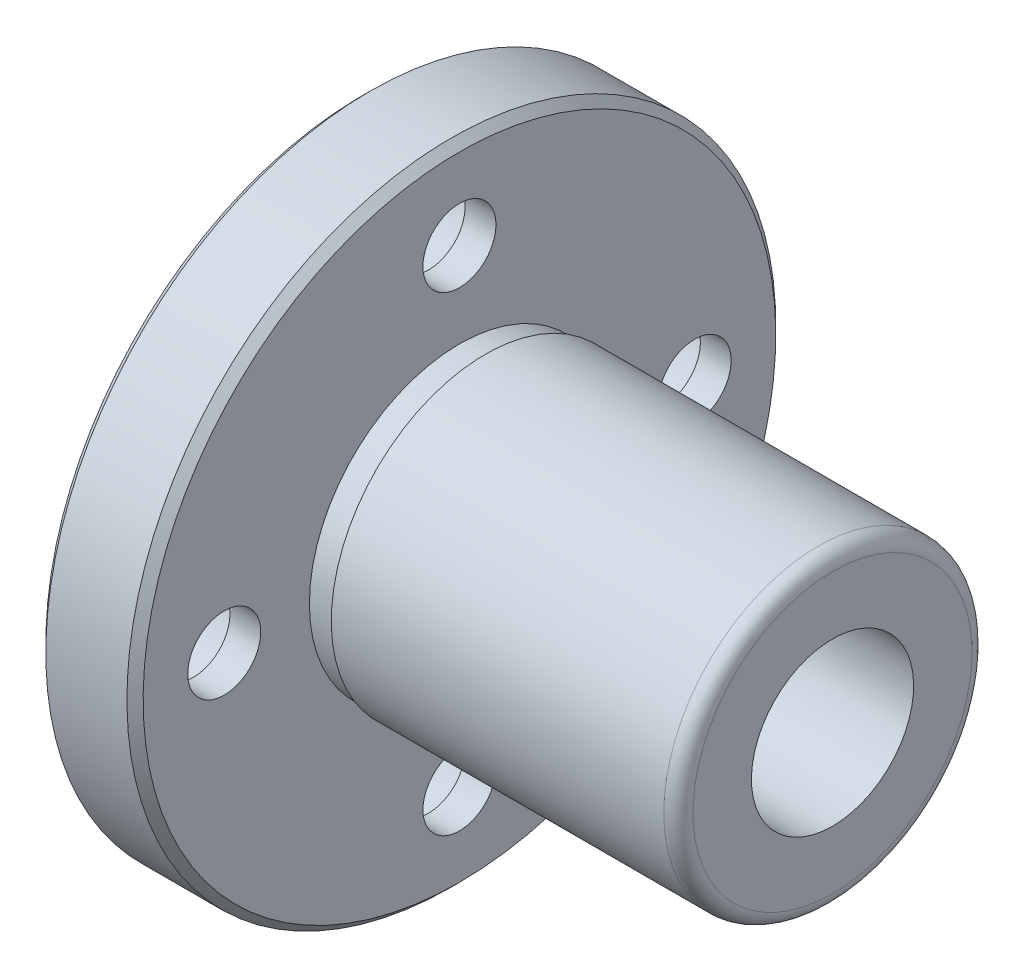
ISO-10303-21;
HEADER;
FILE_DESCRIPTION(('STEP AP214'),'2;1');
FILE_NAME('part.step','',(''),(''),'','','');
FILE_SCHEMA(('AUTOMOTIVE_DESIGN { 1 0 10303 214 1 1 1 1 }'));
ENDSEC;
DATA;
#1=APPLICATION_CONTEXT('core data for automotive mechanical design processes');
#2=APPLICATION_PROTOCOL_DEFINITION('international standard','automotive_design',2000,#1);
#3=PRODUCT_CONTEXT('',#1,'mechanical');
#4=PRODUCT('Part','Part','',(#3));
#5=PRODUCT_RELATED_PRODUCT_CATEGORY('part','',(#4));
#6=PRODUCT_DEFINITION_FORMATION('','',#4);
#7=PRODUCT_DEFINITION_CONTEXT('part definition',#1,'design');
#8=PRODUCT_DEFINITION('design','',#6,#7);
#9=PRODUCT_DEFINITION_SHAPE('','',#8);
#10=(LENGTH_UNIT() NAMED_UNIT(*) SI_UNIT(.MILLI.,.METRE.));
#11=(NAMED_UNIT(*) PLANE_ANGLE_UNIT() SI_UNIT($,.RADIAN.));
#12=(NAMED_UNIT(*) SI_UNIT($,.STERADIAN.) SOLID_ANGLE_UNIT());
#13=UNCERTAINTY_MEASURE_WITH_UNIT(LENGTH_MEASURE(1.E-05),#10,'distance_accuracy_value','');
#14=(GEOMETRIC_REPRESENTATION_CONTEXT(3) GLOBAL_UNCERTAINTY_ASSIGNED_CONTEXT((#13)) GLOBAL_UNIT_ASSIGNED_CONTEXT((#10,
#11,#12)) REPRESENTATION_CONTEXT('',''));
#15=CARTESIAN_POINT('',(0.,0.,0.));
#16=DIRECTION('',(0.,0.,1.));
#17=DIRECTION('',(1.,0.,0.));
#18=AXIS2_PLACEMENT_3D('',#15,#16,#17);
#19=CARTESIAN_POINT('',(-6.,0.,0.));
#20=DIRECTION('',(-1.,0.,0.));
#21=DIRECTION('',(0.,-1.,0.));
#22=AXIS2_PLACEMENT_3D('',#19,#20,#21);
#23=CYLINDRICAL_SURFACE('',#22,9.25);
#24=CARTESIAN_POINT('',(0.,0.,0.));
#25=DIRECTION('',(-1.,0.,0.));
#26=DIRECTION('',(0.,-1.,0.));
#27=AXIS2_PLACEMENT_3D('',#24,#25,#26);
#28=CIRCLE('',#27,9.25);
#29=CARTESIAN_POINT('',(0.,-9.25,0.));
#30=VERTEX_POINT('',#29);
#31=EDGE_CURVE('E208',#30,#30,#28,.F.);
#32=ORIENTED_EDGE('',*,*,#31,.T.);
#33=EDGE_LOOP('',(#32));
#34=FACE_BOUND('',#33,.T.);
#35=CARTESIAN_POINT('',(1.6,0.,0.));
#36=DIRECTION('',(-1.,0.,0.));
#37=DIRECTION('',(0.,-1.,0.));
#38=AXIS2_PLACEMENT_3D('',#35,#36,#37);
#39=CIRCLE('',#38,9.25);
#40=CARTESIAN_POINT('',(1.6,-9.25,0.));
#41=VERTEX_POINT('',#40);
#42=EDGE_CURVE('E211',#41,#41,#39,.T.);
#43=ORIENTED_EDGE('',*,*,#42,.T.);
#44=EDGE_LOOP('',(#43));
#45=FACE_BOUND('',#44,.T.);
#46=ADVANCED_FACE('F17',(#34,#45),#23,.T.);
#47=CARTESIAN_POINT('',(1.6,9.25,0.));
#48=DIRECTION('',(1.,0.,0.));
#49=DIRECTION('',(0.,1.,0.));
#50=AXIS2_PLACEMENT_3D('',#47,#48,#49);
#51=PLANE('',#50);
#52=CARTESIAN_POINT('',(1.6,0.,0.));
#53=DIRECTION('',(-1.,0.,0.));
#54=DIRECTION('',(0.,-1.,0.));
#55=AXIS2_PLACEMENT_3D('',#52,#53,#54);
#56=CIRCLE('',#55,9.5);
#57=CARTESIAN_POINT('',(1.6,-9.5,0.));
#58=VERTEX_POINT('',#57);
#59=EDGE_CURVE('E205',#58,#58,#56,.F.);
#60=ORIENTED_EDGE('',*,*,#59,.F.);
#61=EDGE_LOOP('',(#60));
#62=FACE_BOUND('',#61,.T.);
#63=ORIENTED_EDGE('',*,*,#42,.F.);
#64=EDGE_LOOP('',(#63));
#65=FACE_BOUND('',#64,.T.);
#66=ADVANCED_FACE('F93',(#62,#65),#51,.F.);
#67=CARTESIAN_POINT('',(0.,20.,0.));
#68=DIRECTION('',(-1.,0.,0.));
#69=DIRECTION('',(0.,-1.,0.));
#70=AXIS2_PLACEMENT_3D('',#67,#68,#69);
#71=PLANE('',#70);
#72=ORIENTED_EDGE('',*,*,#31,.F.);
#73=EDGE_LOOP('',(#72));
#74=FACE_BOUND('',#73,.T.);
#75=CARTESIAN_POINT('',(0.,0.,0.));
#76=DIRECTION('',(-1.,0.,0.));
#77=DIRECTION('',(0.,-1.,0.));
#78=AXIS2_PLACEMENT_3D('',#75,#76,#77);
#79=CIRCLE('',#78,19.5);
#80=CARTESIAN_POINT('',(0.,-19.5,0.));
#81=VERTEX_POINT('',#80);
#82=EDGE_CURVE('E190',#81,#81,#79,.T.);
#83=ORIENTED_EDGE('',*,*,#82,.F.);
#84=EDGE_LOOP('',(#83));
#85=FACE_BOUND('',#84,.T.);
#86=CARTESIAN_POINT('',(0.,0.,14.5));
#87=DIRECTION('',(-1.,0.,0.));
#88=DIRECTION('',(0.,0.,1.));
#89=AXIS2_PLACEMENT_3D('',#86,#87,#88);
#90=CIRCLE('',#89,2.25);
#91=CARTESIAN_POINT('',(0.,0.,16.75));
#92=VERTEX_POINT('',#91);
#93=EDGE_CURVE('E193',#92,#92,#90,.T.);
#94=ORIENTED_EDGE('',*,*,#93,.T.);
#95=EDGE_LOOP('',(#94));
#96=FACE_BOUND('',#95,.T.);
#97=CARTESIAN_POINT('',(0.,-14.5,0.));
#98=DIRECTION('',(-1.,0.,0.));
#99=DIRECTION('',(0.,0.,1.));
#100=AXIS2_PLACEMENT_3D('',#97,#98,#99);
#101=CIRCLE('',#100,2.25);
#102=CARTESIAN_POINT('',(0.,-14.5,2.25));
#103=VERTEX_POINT('',#102);
#104=EDGE_CURVE('E196',#103,#103,#101,.T.);
#105=ORIENTED_EDGE('',*,*,#104,.T.);
#106=EDGE_LOOP('',(#105));
#107=FACE_BOUND('',#106,.T.);
#108=CARTESIAN_POINT('',(0.,0.,-14.5));
#109=DIRECTION('',(-1.,0.,0.));
#110=DIRECTION('',(0.,0.,1.));
#111=AXIS2_PLACEMENT_3D('',#108,#109,#110);
#112=CIRCLE('',#111,2.25);
#113=CARTESIAN_POINT('',(0.,0.,-12.25));
#114=VERTEX_POINT('',#113);
#115=EDGE_CURVE('E199',#114,#114,#112,.T.);
#116=ORIENTED_EDGE('',*,*,#115,.T.);
#117=EDGE_LOOP('',(#116));
#118=FACE_BOUND('',#117,.T.);
#119=CARTESIAN_POINT('',(0.,14.5,0.));
#120=DIRECTION('',(-1.,0.,0.));
#121=DIRECTION('',(0.,0.,1.));
#122=AXIS2_PLACEMENT_3D('',#119,#120,#121);
#123=CIRCLE('',#122,2.25);
#124=CARTESIAN_POINT('',(0.,14.5,2.25));
#125=VERTEX_POINT('',#124);
#126=EDGE_CURVE('E202',#125,#125,#123,.T.);
#127=ORIENTED_EDGE('',*,*,#126,.T.);
#128=EDGE_LOOP('',(#127));
#129=FACE_BOUND('',#128,.T.);
#130=ADVANCED_FACE('F90',(#74,#85,#96,#107,#118,#129),#71,.F.);
#131=CARTESIAN_POINT('',(-6.,0.,0.));
#132=DIRECTION('',(-1.,0.,0.));
#133=DIRECTION('',(0.,-1.,0.));
#134=AXIS2_PLACEMENT_3D('',#131,#132,#133);
#135=CYLINDRICAL_SURFACE('',#134,9.5);
#136=CARTESIAN_POINT('',(22.1,0.,0.));
#137=DIRECTION('',(-1.,0.,0.));
#138=DIRECTION('',(0.,-1.,0.));
#139=AXIS2_PLACEMENT_3D('',#136,#137,#138);
#140=CIRCLE('',#139,9.5);
#141=CARTESIAN_POINT('',(22.1,-9.5,0.));
#142=VERTEX_POINT('',#141);
#143=EDGE_CURVE('E189',#142,#142,#140,.F.);
#144=ORIENTED_EDGE('',*,*,#143,.F.);
#145=EDGE_LOOP('',(#144));
#146=FACE_BOUND('',#145,.T.);
#147=ORIENTED_EDGE('',*,*,#59,.T.);
#148=EDGE_LOOP('',(#147));
#149=FACE_BOUND('',#148,.T.);
#150=ADVANCED_FACE('F86',(#146,#149),#135,.T.);
#151=CARTESIAN_POINT('',(-6.,14.5,0.));
#152=DIRECTION('',(-1.,0.,0.));
#153=DIRECTION('',(0.,0.,1.));
#154=AXIS2_PLACEMENT_3D('',#151,#152,#153);
#155=CYLINDRICAL_SURFACE('',#154,2.25);
#156=ORIENTED_EDGE('',*,*,#126,.F.);
#157=EDGE_LOOP('',(#156));
#158=FACE_BOUND('',#157,.T.);
#159=CARTESIAN_POINT('',(-1.9,14.5,0.));
#160=DIRECTION('',(-1.,0.,0.));
#161=DIRECTION('',(0.,0.,1.));
#162=AXIS2_PLACEMENT_3D('',#159,#160,#161);
#163=CIRCLE('',#162,2.25);
#164=CARTESIAN_POINT('',(-1.9,14.5,2.25));
#165=VERTEX_POINT('',#164);
#166=EDGE_CURVE('E186',#165,#165,#163,.T.);
#167=ORIENTED_EDGE('',*,*,#166,.T.);
#168=EDGE_LOOP('',(#167));
#169=FACE_BOUND('',#168,.T.);
#170=ADVANCED_FACE('F82',(#158,#169),#155,.F.);
#171=CARTESIAN_POINT('',(-6.,0.,-14.5));
#172=DIRECTION('',(-1.,0.,0.));
#173=DIRECTION('',(0.,0.,1.));
#174=AXIS2_PLACEMENT_3D('',#171,#172,#173);
#175=CYLINDRICAL_SURFACE('',#174,2.25);
#176=ORIENTED_EDGE('',*,*,#115,.F.);
#177=EDGE_LOOP('',(#176));
#178=FACE_BOUND('',#177,.T.);
#179=CARTESIAN_POINT('',(-1.9,0.,-14.5));
#180=DIRECTION('',(-1.,0.,0.));
#181=DIRECTION('',(0.,0.,1.));
#182=AXIS2_PLACEMENT_3D('',#179,#180,#181);
#183=CIRCLE('',#182,2.25);
#184=CARTESIAN_POINT('',(-1.9,0.,-12.25));
#185=VERTEX_POINT('',#184);
#186=EDGE_CURVE('E183',#185,#185,#183,.T.);
#187=ORIENTED_EDGE('',*,*,#186,.T.);
#188=EDGE_LOOP('',(#187));
#189=FACE_BOUND('',#188,.T.);
#190=ADVANCED_FACE('F78',(#178,#189),#175,.F.);
#191=CARTESIAN_POINT('',(-6.,-14.5,0.));
#192=DIRECTION('',(-1.,0.,0.));
#193=DIRECTION('',(0.,0.,1.));
#194=AXIS2_PLACEMENT_3D('',#191,#192,#193);
#195=CYLINDRICAL_SURFACE('',#194,2.25);
#196=ORIENTED_EDGE('',*,*,#104,.F.);
#197=EDGE_LOOP('',(#196));
#198=FACE_BOUND('',#197,.T.);
#199=CARTESIAN_POINT('',(-1.9,-14.5,0.));
#200=DIRECTION('',(-1.,0.,0.));
#201=DIRECTION('',(0.,0.,1.));
#202=AXIS2_PLACEMENT_3D('',#199,#200,#201);
#203=CIRCLE('',#202,2.25);
#204=CARTESIAN_POINT('',(-1.9,-14.5,2.25));
#205=VERTEX_POINT('',#204);
#206=EDGE_CURVE('E180',#205,#205,#203,.T.);
#207=ORIENTED_EDGE('',*,*,#206,.T.);
#208=EDGE_LOOP('',(#207));
#209=FACE_BOUND('',#208,.T.);
#210=ADVANCED_FACE('F74',(#198,#209),#195,.F.);
#211=CARTESIAN_POINT('',(-6.,0.,14.5));
#212=DIRECTION('',(-1.,0.,0.));
#213=DIRECTION('',(0.,0.,1.));
#214=AXIS2_PLACEMENT_3D('',#211,#212,#213);
#215=CYLINDRICAL_SURFACE('',#214,2.25);
#216=ORIENTED_EDGE('',*,*,#93,.F.);
#217=EDGE_LOOP('',(#216));
#218=FACE_BOUND('',#217,.T.);
#219=CARTESIAN_POINT('',(-1.9,0.,14.5));
#220=DIRECTION('',(-1.,0.,0.));
#221=DIRECTION('',(0.,0.,1.));
#222=AXIS2_PLACEMENT_3D('',#219,#220,#221);
#223=CIRCLE('',#222,2.25);
#224=CARTESIAN_POINT('',(-1.9,0.,16.75));
#225=VERTEX_POINT('',#224);
#226=EDGE_CURVE('E177',#225,#225,#223,.T.);
#227=ORIENTED_EDGE('',*,*,#226,.T.);
#228=EDGE_LOOP('',(#227));
#229=FACE_BOUND('',#228,.T.);
#230=ADVANCED_FACE('F70',(#218,#229),#215,.F.);
#231=CARTESIAN_POINT('',(-0.500000000000001,0.,0.));
#232=DIRECTION('',(-1.,0.,0.));
#233=DIRECTION('',(0.,-1.,0.));
#234=AXIS2_PLACEMENT_3D('',#231,#232,#233);
#235=CONICAL_SURFACE('',#234,20.,0.785398163397451);
#236=ORIENTED_EDGE('',*,*,#82,.T.);
#237=EDGE_LOOP('',(#236));
#238=FACE_BOUND('',#237,.T.);
#239=CARTESIAN_POINT('',(-0.500000000000001,0.,0.));
#240=DIRECTION('',(-1.,0.,0.));
#241=DIRECTION('',(0.,-1.,0.));
#242=AXIS2_PLACEMENT_3D('',#239,#240,#241);
#243=CIRCLE('',#242,20.);
#244=CARTESIAN_POINT('',(-0.500000000000001,-20.,0.));
#245=VERTEX_POINT('',#244);
#246=EDGE_CURVE('E41',#245,#245,#243,.T.);
#247=ORIENTED_EDGE('',*,*,#246,.F.);
#248=EDGE_LOOP('',(#247));
#249=FACE_BOUND('',#248,.T.);
#250=ADVANCED_FACE('F65',(#238,#249),#235,.T.);
#251=CARTESIAN_POINT('',(22.1,0.,0.));
#252=DIRECTION('',(-1.,0.,0.));
#253=DIRECTION('',(0.,-1.,0.));
#254=AXIS2_PLACEMENT_3D('',#251,#252,#253);
#255=TOROIDAL_SURFACE('',#254,8.6,0.9);
#256=CARTESIAN_POINT('',(23.,0.,0.));
#257=DIRECTION('',(-1.,0.,0.));
#258=DIRECTION('',(0.,-1.,0.));
#259=AXIS2_PLACEMENT_3D('',#256,#257,#258);
#260=CIRCLE('',#259,8.6);
#261=CARTESIAN_POINT('',(23.,-8.6,0.));
#262=VERTEX_POINT('',#261);
#263=CARTESIAN_POINT('',(23.,8.6,0.));
#264=VERTEX_POINT('',#263);
#265=EDGE_CURVE('E37',#262,#264,#260,.T.);
#266=ORIENTED_EDGE('',*,*,#265,.T.);
#267=CARTESIAN_POINT('',(23.,0.,0.));
#268=DIRECTION('',(-1.,0.,0.));
#269=DIRECTION('',(0.,1.,0.));
#270=AXIS2_PLACEMENT_3D('',#267,#268,#269);
#271=CIRCLE('',#270,8.6);
#272=EDGE_CURVE('E34',#264,#262,#271,.T.);
#273=ORIENTED_EDGE('',*,*,#272,.T.);
#274=EDGE_LOOP('',(#266,#273));
#275=FACE_BOUND('',#274,.T.);
#276=ORIENTED_EDGE('',*,*,#143,.T.);
#277=EDGE_LOOP('',(#276));
#278=FACE_BOUND('',#277,.T.);
#279=ADVANCED_FACE('F44',(#275,#278),#255,.T.);
#280=CARTESIAN_POINT('',(-1.9,16.75,0.));
#281=DIRECTION('',(1.,0.,0.));
#282=DIRECTION('',(0.,0.,-1.));
#283=AXIS2_PLACEMENT_3D('',#280,#281,#282);
#284=PLANE('',#283);
#285=CARTESIAN_POINT('',(-1.9,14.5,0.));
#286=DIRECTION('',(-1.,0.,0.));
#287=DIRECTION('',(0.,0.,1.));
#288=AXIS2_PLACEMENT_3D('',#285,#286,#287);
#289=CIRCLE('',#288,3.75);
#290=CARTESIAN_POINT('',(-1.9,14.5,3.75));
#291=VERTEX_POINT('',#290);
#292=EDGE_CURVE('E46',#291,#291,#289,.T.);
#293=ORIENTED_EDGE('',*,*,#292,.T.);
#294=EDGE_LOOP('',(#293));
#295=FACE_BOUND('',#294,.T.);
#296=ORIENTED_EDGE('',*,*,#166,.F.);
#297=EDGE_LOOP('',(#296));
#298=FACE_BOUND('',#297,.T.);
#299=ADVANCED_FACE('F64',(#295,#298),#284,.F.);
#300=CARTESIAN_POINT('',(-1.9,2.25,-14.5));
#301=DIRECTION('',(1.,0.,0.));
#302=DIRECTION('',(0.,0.,-1.));
#303=AXIS2_PLACEMENT_3D('',#300,#301,#302);
#304=PLANE('',#303);
#305=CARTESIAN_POINT('',(-1.9,0.,-14.5));
#306=DIRECTION('',(-1.,0.,0.));
#307=DIRECTION('',(0.,0.,1.));
#308=AXIS2_PLACEMENT_3D('',#305,#306,#307);
#309=CIRCLE('',#308,3.75);
#310=CARTESIAN_POINT('',(-1.9,0.,-10.75));
#311=VERTEX_POINT('',#310);
#312=EDGE_CURVE('E169',#311,#311,#309,.T.);
#313=ORIENTED_EDGE('',*,*,#312,.T.);
#314=EDGE_LOOP('',(#313));
#315=FACE_BOUND('',#314,.T.);
#316=ORIENTED_EDGE('',*,*,#186,.F.);
#317=EDGE_LOOP('',(#316));
#318=FACE_BOUND('',#317,.T.);
#319=ADVANCED_FACE('F230',(#315,#318),#304,.F.);
#320=CARTESIAN_POINT('',(-1.9,-12.25,0.));
#321=DIRECTION('',(1.,0.,0.));
#322=DIRECTION('',(0.,0.,-1.));
#323=AXIS2_PLACEMENT_3D('',#320,#321,#322);
#324=PLANE('',#323);
#325=CARTESIAN_POINT('',(-1.9,-14.5,0.));
#326=DIRECTION('',(-1.,0.,0.));
#327=DIRECTION('',(0.,0.,1.));
#328=AXIS2_PLACEMENT_3D('',#325,#326,#327);
#329=CIRCLE('',#328,3.75);
#330=CARTESIAN_POINT('',(-1.9,-14.5,3.75));
#331=VERTEX_POINT('',#330);
#332=EDGE_CURVE('E164',#331,#331,#329,.T.);
#333=ORIENTED_EDGE('',*,*,#332,.T.);
#334=EDGE_LOOP('',(#333));
#335=FACE_BOUND('',#334,.T.);
#336=ORIENTED_EDGE('',*,*,#206,.F.);
#337=EDGE_LOOP('',(#336));
#338=FACE_BOUND('',#337,.T.);
#339=ADVANCED_FACE('F235',(#335,#338),#324,.F.);
#340=CARTESIAN_POINT('',(-1.9,2.25,14.5));
#341=DIRECTION('',(1.,0.,0.));
#342=DIRECTION('',(0.,0.,-1.));
#343=AXIS2_PLACEMENT_3D('',#340,#341,#342);
#344=PLANE('',#343);
#345=CARTESIAN_POINT('',(-1.9,0.,14.5));
#346=DIRECTION('',(-1.,0.,0.));
#347=DIRECTION('',(0.,0.,1.));
#348=AXIS2_PLACEMENT_3D('',#345,#346,#347);
#349=CIRCLE('',#348,3.75);
#350=CARTESIAN_POINT('',(-1.9,0.,18.25));
#351=VERTEX_POINT('',#350);
#352=EDGE_CURVE('E157',#351,#351,#349,.T.);
#353=ORIENTED_EDGE('',*,*,#352,.T.);
#354=EDGE_LOOP('',(#353));
#355=FACE_BOUND('',#354,.T.);
#356=ORIENTED_EDGE('',*,*,#226,.F.);
#357=EDGE_LOOP('',(#356));
#358=FACE_BOUND('',#357,.T.);
#359=ADVANCED_FACE('F269',(#355,#358),#344,.F.);
#360=CARTESIAN_POINT('',(-6.,0.,0.));
#361=DIRECTION('',(-1.,0.,0.));
#362=DIRECTION('',(0.,-1.,0.));
#363=AXIS2_PLACEMENT_3D('',#360,#361,#362);
#364=CYLINDRICAL_SURFACE('',#363,20.);
#365=ORIENTED_EDGE('',*,*,#246,.T.);
#366=EDGE_LOOP('',(#365));
#367=FACE_BOUND('',#366,.T.);
#368=CARTESIAN_POINT('',(-5.50000000000001,0.,0.));
#369=DIRECTION('',(1.,0.,0.));
#370=DIRECTION('',(0.,1.,0.));
#371=AXIS2_PLACEMENT_3D('',#368,#369,#370);
#372=CIRCLE('',#371,20.);
#373=CARTESIAN_POINT('',(-5.50000000000001,20.,0.));
#374=VERTEX_POINT('',#373);
#375=EDGE_CURVE('E149',#374,#374,#372,.F.);
#376=ORIENTED_EDGE('',*,*,#375,.F.);
#377=EDGE_LOOP('',(#376));
#378=FACE_BOUND('',#377,.T.);
#379=ADVANCED_FACE('F140',(#367,#378),#364,.T.);
#380=CARTESIAN_POINT('',(23.,9.5,0.));
#381=DIRECTION('',(-1.,0.,0.));
#382=DIRECTION('',(0.,-1.,0.));
#383=AXIS2_PLACEMENT_3D('',#380,#381,#382);
#384=PLANE('',#383);
#385=CARTESIAN_POINT('',(23.,0.,0.));
#386=DIRECTION('',(-1.,0.,0.));
#387=DIRECTION('',(0.,-1.,0.));
#388=AXIS2_PLACEMENT_3D('',#385,#386,#387);
#389=CIRCLE('',#388,5.);
#390=CARTESIAN_POINT('',(23.,-5.,0.));
#391=VERTEX_POINT('',#390);
#392=EDGE_CURVE('E156',#391,#391,#389,.T.);
#393=ORIENTED_EDGE('',*,*,#392,.T.);
#394=EDGE_LOOP('',(#393));
#395=FACE_BOUND('',#394,.T.);
#396=ORIENTED_EDGE('',*,*,#265,.F.);
#397=ORIENTED_EDGE('',*,*,#272,.F.);
#398=EDGE_LOOP('',(#396,#397));
#399=FACE_BOUND('',#398,.T.);
#400=ADVANCED_FACE('F39',(#395,#399),#384,.F.);
#401=CARTESIAN_POINT('',(-6.,14.5,0.));
#402=DIRECTION('',(-1.,0.,0.));
#403=DIRECTION('',(0.,0.,1.));
#404=AXIS2_PLACEMENT_3D('',#401,#402,#403);
#405=CYLINDRICAL_SURFACE('',#404,3.75);
#406=ORIENTED_EDGE('',*,*,#292,.F.);
#407=EDGE_LOOP('',(#406));
#408=FACE_BOUND('',#407,.T.);
#409=CARTESIAN_POINT('',(-6.,14.5,0.));
#410=DIRECTION('',(-1.,0.,0.));
#411=DIRECTION('',(0.,0.,1.));
#412=AXIS2_PLACEMENT_3D('',#409,#410,#411);
#413=CIRCLE('',#412,3.75);
#414=CARTESIAN_POINT('',(-6.,14.5,3.75));
#415=VERTEX_POINT('',#414);
#416=EDGE_CURVE('E161',#415,#415,#413,.T.);
#417=ORIENTED_EDGE('',*,*,#416,.T.);
#418=EDGE_LOOP('',(#417));
#419=FACE_BOUND('',#418,.T.);
#420=ADVANCED_FACE('F132',(#408,#419),#405,.F.);
#421=CARTESIAN_POINT('',(-6.,0.,-14.5));
#422=DIRECTION('',(-1.,0.,0.));
#423=DIRECTION('',(0.,0.,1.));
#424=AXIS2_PLACEMENT_3D('',#421,#422,#423);
#425=CYLINDRICAL_SURFACE('',#424,3.75);
#426=ORIENTED_EDGE('',*,*,#312,.F.);
#427=EDGE_LOOP('',(#426));
#428=FACE_BOUND('',#427,.T.);
#429=CARTESIAN_POINT('',(-6.,0.,-14.5));
#430=DIRECTION('',(-1.,0.,0.));
#431=DIRECTION('',(0.,0.,1.));
#432=AXIS2_PLACEMENT_3D('',#429,#430,#431);
#433=CIRCLE('',#432,3.75);
#434=CARTESIAN_POINT('',(-6.,0.,-10.75));
#435=VERTEX_POINT('',#434);
#436=EDGE_CURVE('E242',#435,#435,#433,.T.);
#437=ORIENTED_EDGE('',*,*,#436,.T.);
#438=EDGE_LOOP('',(#437));
#439=FACE_BOUND('',#438,.T.);
#440=ADVANCED_FACE('F128',(#428,#439),#425,.F.);
#441=CARTESIAN_POINT('',(-6.,-14.5,0.));
#442=DIRECTION('',(-1.,0.,0.));
#443=DIRECTION('',(0.,0.,1.));
#444=AXIS2_PLACEMENT_3D('',#441,#442,#443);
#445=CYLINDRICAL_SURFACE('',#444,3.75);
#446=ORIENTED_EDGE('',*,*,#332,.F.);
#447=EDGE_LOOP('',(#446));
#448=FACE_BOUND('',#447,.T.);
#449=CARTESIAN_POINT('',(-6.,-14.5,0.));
#450=DIRECTION('',(-1.,0.,0.));
#451=DIRECTION('',(0.,0.,1.));
#452=AXIS2_PLACEMENT_3D('',#449,#450,#451);
#453=CIRCLE('',#452,3.75);
#454=CARTESIAN_POINT('',(-6.,-14.5,3.75));
#455=VERTEX_POINT('',#454);
#456=EDGE_CURVE('E244',#455,#455,#453,.T.);
#457=ORIENTED_EDGE('',*,*,#456,.T.);
#458=EDGE_LOOP('',(#457));
#459=FACE_BOUND('',#458,.T.);
#460=ADVANCED_FACE('F124',(#448,#459),#445,.F.);
#461=CARTESIAN_POINT('',(-6.,0.,14.5));
#462=DIRECTION('',(-1.,0.,0.));
#463=DIRECTION('',(0.,0.,1.));
#464=AXIS2_PLACEMENT_3D('',#461,#462,#463);
#465=CYLINDRICAL_SURFACE('',#464,3.75);
#466=ORIENTED_EDGE('',*,*,#352,.F.);
#467=EDGE_LOOP('',(#466));
#468=FACE_BOUND('',#467,.T.);
#469=CARTESIAN_POINT('',(-6.,0.,14.5));
#470=DIRECTION('',(-1.,0.,0.));
#471=DIRECTION('',(0.,0.,1.));
#472=AXIS2_PLACEMENT_3D('',#469,#470,#471);
#473=CIRCLE('',#472,3.75);
#474=CARTESIAN_POINT('',(-6.,0.,18.25));
#475=VERTEX_POINT('',#474);
#476=EDGE_CURVE('E249',#475,#475,#473,.T.);
#477=ORIENTED_EDGE('',*,*,#476,.T.);
#478=EDGE_LOOP('',(#477));
#479=FACE_BOUND('',#478,.T.);
#480=ADVANCED_FACE('F120',(#468,#479),#465,.F.);
#481=CARTESIAN_POINT('',(-5.50000000000001,0.,0.));
#482=DIRECTION('',(1.,0.,0.));
#483=DIRECTION('',(0.,0.,-1.));
#484=AXIS2_PLACEMENT_3D('',#481,#482,#483);
#485=CONICAL_SURFACE('',#484,20.,0.785398163397448);
#486=CARTESIAN_POINT('',(-6.,0.,0.));
#487=DIRECTION('',(1.,0.,0.));
#488=DIRECTION('',(0.,0.,-1.));
#489=AXIS2_PLACEMENT_3D('',#486,#487,#488);
#490=CIRCLE('',#489,19.5);
#491=CARTESIAN_POINT('',(-6.,0.,-19.5));
#492=VERTEX_POINT('',#491);
#493=EDGE_CURVE('E27',#492,#492,#490,.T.);
#494=ORIENTED_EDGE('',*,*,#493,.T.);
#495=EDGE_LOOP('',(#494));
#496=FACE_BOUND('',#495,.T.);
#497=ORIENTED_EDGE('',*,*,#375,.T.);
#498=EDGE_LOOP('',(#497));
#499=FACE_BOUND('',#498,.T.);
#500=ADVANCED_FACE('F112',(#496,#499),#485,.T.);
#501=CARTESIAN_POINT('',(-6.,0.,0.));
#502=DIRECTION('',(-1.,0.,0.));
#503=DIRECTION('',(0.,-1.,0.));
#504=AXIS2_PLACEMENT_3D('',#501,#502,#503);
#505=CYLINDRICAL_SURFACE('',#504,5.);
#506=ORIENTED_EDGE('',*,*,#392,.F.);
#507=EDGE_LOOP('',(#506));
#508=FACE_BOUND('',#507,.T.);
#509=CARTESIAN_POINT('',(-6.,0.,0.));
#510=DIRECTION('',(-1.,0.,0.));
#511=DIRECTION('',(0.,-1.,0.));
#512=AXIS2_PLACEMENT_3D('',#509,#510,#511);
#513=CIRCLE('',#512,5.);
#514=CARTESIAN_POINT('',(-6.,-5.,0.));
#515=VERTEX_POINT('',#514);
#516=EDGE_CURVE('E11',#515,#515,#513,.T.);
#517=ORIENTED_EDGE('',*,*,#516,.T.);
#518=EDGE_LOOP('',(#517));
#519=FACE_BOUND('',#518,.T.);
#520=ADVANCED_FACE('F106',(#508,#519),#505,.F.);
#521=CARTESIAN_POINT('',(-6.,5.,0.));
#522=DIRECTION('',(1.,0.,0.));
#523=DIRECTION('',(0.,1.,0.));
#524=AXIS2_PLACEMENT_3D('',#521,#522,#523);
#525=PLANE('',#524);
#526=ORIENTED_EDGE('',*,*,#516,.F.);
#527=EDGE_LOOP('',(#526));
#528=FACE_BOUND('',#527,.T.);
#529=ORIENTED_EDGE('',*,*,#493,.F.);
#530=EDGE_LOOP('',(#529));
#531=FACE_BOUND('',#530,.T.);
#532=ORIENTED_EDGE('',*,*,#476,.F.);
#533=EDGE_LOOP('',(#532));
#534=FACE_BOUND('',#533,.T.);
#535=ORIENTED_EDGE('',*,*,#456,.F.);
#536=EDGE_LOOP('',(#535));
#537=FACE_BOUND('',#536,.T.);
#538=ORIENTED_EDGE('',*,*,#436,.F.);
#539=EDGE_LOOP('',(#538));
#540=FACE_BOUND('',#539,.T.);
#541=ORIENTED_EDGE('',*,*,#416,.F.);
#542=EDGE_LOOP('',(#541));
#543=FACE_BOUND('',#542,.T.);
#544=ADVANCED_FACE('F104',(#528,#531,#534,#537,#540,#543),#525,.F.);
#545=CLOSED_SHELL('',(#46,#66,#130,#150,#170,#190,#210,#230,#250,#279,#299,#319,#339,#359,#379,
#400,#420,#440,#460,#480,#500,#520,#544));
#546=MANIFOLD_SOLID_BREP('B1',#545);
#547=ADVANCED_BREP_SHAPE_REPRESENTATION('',(#18,#546),#14);
#548=SHAPE_DEFINITION_REPRESENTATION(#9,#547);
ENDSEC;
END-ISO-10303-21;
